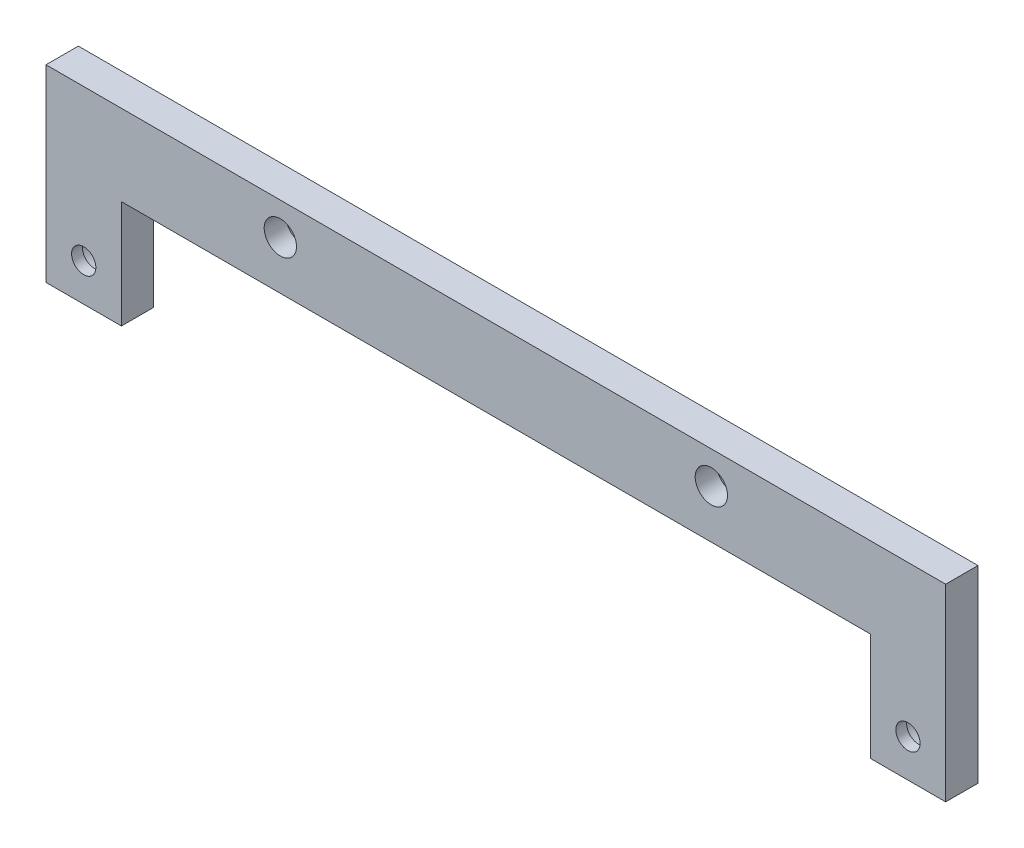
ISO-10303-21;
HEADER;
FILE_DESCRIPTION(('STEP AP214'),'2;1');
FILE_NAME('part.step','',(''),(''),'','','');
FILE_SCHEMA(('AUTOMOTIVE_DESIGN { 1 0 10303 214 1 1 1 1 }'));
ENDSEC;
DATA;
#1=APPLICATION_CONTEXT('core data for automotive mechanical design processes');
#2=APPLICATION_PROTOCOL_DEFINITION('international standard','automotive_design',2000,#1);
#3=PRODUCT_CONTEXT('',#1,'mechanical');
#4=PRODUCT('Part','Part','',(#3));
#5=PRODUCT_RELATED_PRODUCT_CATEGORY('part','',(#4));
#6=PRODUCT_DEFINITION_FORMATION('','',#4);
#7=PRODUCT_DEFINITION_CONTEXT('part definition',#1,'design');
#8=PRODUCT_DEFINITION('design','',#6,#7);
#9=PRODUCT_DEFINITION_SHAPE('','',#8);
#10=(LENGTH_UNIT() NAMED_UNIT(*) SI_UNIT(.MILLI.,.METRE.));
#11=(NAMED_UNIT(*) PLANE_ANGLE_UNIT() SI_UNIT($,.RADIAN.));
#12=(NAMED_UNIT(*) SI_UNIT($,.STERADIAN.) SOLID_ANGLE_UNIT());
#13=UNCERTAINTY_MEASURE_WITH_UNIT(LENGTH_MEASURE(1.E-05),#10,'distance_accuracy_value','');
#14=(GEOMETRIC_REPRESENTATION_CONTEXT(3) GLOBAL_UNCERTAINTY_ASSIGNED_CONTEXT((#13)) GLOBAL_UNIT_ASSIGNED_CONTEXT((#10,
#11,#12)) REPRESENTATION_CONTEXT('',''));
#15=CARTESIAN_POINT('',(0.,0.,0.));
#16=DIRECTION('',(0.,0.,1.));
#17=DIRECTION('',(1.,0.,0.));
#18=AXIS2_PLACEMENT_3D('',#15,#16,#17);
#19=CARTESIAN_POINT('',(76.5,-10.5,0.));
#20=DIRECTION('',(0.,0.,-1.));
#21=DIRECTION('',(-1.,0.,0.));
#22=AXIS2_PLACEMENT_3D('',#19,#20,#21);
#23=CYLINDRICAL_SURFACE('',#22,4.);
#24=CARTESIAN_POINT('',(76.5,-10.5,4.));
#25=DIRECTION('',(0.,0.,-1.));
#26=DIRECTION('',(-1.,0.,0.));
#27=AXIS2_PLACEMENT_3D('',#24,#25,#26);
#28=CIRCLE('',#27,4.);
#29=CARTESIAN_POINT('',(72.5,-10.5,4.));
#30=VERTEX_POINT('',#29);
#31=EDGE_CURVE('E20',#30,#30,#28,.F.);
#32=ORIENTED_EDGE('',*,*,#31,.T.);
#33=EDGE_LOOP('',(#32));
#34=FACE_BOUND('',#33,.T.);
#35=CARTESIAN_POINT('',(76.5,-10.5,0.));
#36=DIRECTION('',(0.,0.,-1.));
#37=DIRECTION('',(-1.,0.,0.));
#38=AXIS2_PLACEMENT_3D('',#35,#36,#37);
#39=CIRCLE('',#38,4.);
#40=CARTESIAN_POINT('',(72.5,-10.5,0.));
#41=VERTEX_POINT('',#40);
#42=EDGE_CURVE('E143',#41,#41,#39,.T.);
#43=ORIENTED_EDGE('',*,*,#42,.T.);
#44=EDGE_LOOP('',(#43));
#45=FACE_BOUND('',#44,.T.);
#46=ADVANCED_FACE('F17',(#34,#45),#23,.F.);
#47=CARTESIAN_POINT('',(-76.5,-10.5,0.));
#48=DIRECTION('',(0.,0.,-1.));
#49=DIRECTION('',(-1.,0.,0.));
#50=AXIS2_PLACEMENT_3D('',#47,#48,#49);
#51=CYLINDRICAL_SURFACE('',#50,4.);
#52=CARTESIAN_POINT('',(-76.5,-10.5,4.));
#53=DIRECTION('',(0.,0.,-1.));
#54=DIRECTION('',(-1.,0.,0.));
#55=AXIS2_PLACEMENT_3D('',#52,#53,#54);
#56=CIRCLE('',#55,4.);
#57=CARTESIAN_POINT('',(-80.5,-10.5,4.));
#58=VERTEX_POINT('',#57);
#59=EDGE_CURVE('E151',#58,#58,#56,.F.);
#60=ORIENTED_EDGE('',*,*,#59,.T.);
#61=EDGE_LOOP('',(#60));
#62=FACE_BOUND('',#61,.T.);
#63=CARTESIAN_POINT('',(-76.5,-10.5,0.));
#64=DIRECTION('',(0.,0.,-1.));
#65=DIRECTION('',(-1.,0.,0.));
#66=AXIS2_PLACEMENT_3D('',#63,#64,#65);
#67=CIRCLE('',#66,4.);
#68=CARTESIAN_POINT('',(-80.5,-10.5,0.));
#69=VERTEX_POINT('',#68);
#70=EDGE_CURVE('E140',#69,#69,#67,.T.);
#71=ORIENTED_EDGE('',*,*,#70,.T.);
#72=EDGE_LOOP('',(#71));
#73=FACE_BOUND('',#72,.T.);
#74=ADVANCED_FACE('F241',(#62,#73),#51,.F.);
#75=CARTESIAN_POINT('',(-40.,11.5,6.));
#76=DIRECTION('',(0.,0.,1.));
#77=DIRECTION('',(1.,0.,0.));
#78=AXIS2_PLACEMENT_3D('',#75,#76,#77);
#79=CYLINDRICAL_SURFACE('',#78,1.75000000000001);
#80=CARTESIAN_POINT('',(-40.,11.5,0.));
#81=DIRECTION('',(0.,0.,1.));
#82=DIRECTION('',(1.,0.,0.));
#83=AXIS2_PLACEMENT_3D('',#80,#81,#82);
#84=CIRCLE('',#83,1.75000000000001);
#85=CARTESIAN_POINT('',(-38.25,11.5,0.));
#86=VERTEX_POINT('',#85);
#87=EDGE_CURVE('E137',#86,#86,#84,.F.);
#88=ORIENTED_EDGE('',*,*,#87,.T.);
#89=EDGE_LOOP('',(#88));
#90=FACE_BOUND('',#89,.T.);
#91=CARTESIAN_POINT('',(-40.,11.5,2.));
#92=DIRECTION('',(0.,0.,1.));
#93=DIRECTION('',(1.,0.,0.));
#94=AXIS2_PLACEMENT_3D('',#91,#92,#93);
#95=CIRCLE('',#94,1.75000000000001);
#96=CARTESIAN_POINT('',(-38.25,11.5,2.));
#97=VERTEX_POINT('',#96);
#98=EDGE_CURVE('E149',#97,#97,#95,.T.);
#99=ORIENTED_EDGE('',*,*,#98,.T.);
#100=EDGE_LOOP('',(#99));
#101=FACE_BOUND('',#100,.T.);
#102=ADVANCED_FACE('F238',(#90,#101),#79,.F.);
#103=CARTESIAN_POINT('',(40.,11.5,6.));
#104=DIRECTION('',(0.,0.,1.));
#105=DIRECTION('',(1.,0.,0.));
#106=AXIS2_PLACEMENT_3D('',#103,#104,#105);
#107=CYLINDRICAL_SURFACE('',#106,1.75000000000001);
#108=CARTESIAN_POINT('',(40.,11.5,0.));
#109=DIRECTION('',(0.,0.,1.));
#110=DIRECTION('',(1.,0.,0.));
#111=AXIS2_PLACEMENT_3D('',#108,#109,#110);
#112=CIRCLE('',#111,1.75000000000001);
#113=CARTESIAN_POINT('',(41.75,11.5,0.));
#114=VERTEX_POINT('',#113);
#115=EDGE_CURVE('E134',#114,#114,#112,.F.);
#116=ORIENTED_EDGE('',*,*,#115,.T.);
#117=EDGE_LOOP('',(#116));
#118=FACE_BOUND('',#117,.T.);
#119=CARTESIAN_POINT('',(40.,11.5,2.));
#120=DIRECTION('',(0.,0.,1.));
#121=DIRECTION('',(1.,0.,0.));
#122=AXIS2_PLACEMENT_3D('',#119,#120,#121);
#123=CIRCLE('',#122,1.75000000000001);
#124=CARTESIAN_POINT('',(41.75,11.5,2.));
#125=VERTEX_POINT('',#124);
#126=EDGE_CURVE('E146',#125,#125,#123,.T.);
#127=ORIENTED_EDGE('',*,*,#126,.T.);
#128=EDGE_LOOP('',(#127));
#129=FACE_BOUND('',#128,.T.);
#130=ADVANCED_FACE('F164',(#118,#129),#107,.F.);
#131=CARTESIAN_POINT('',(78.75,-10.5,4.));
#132=DIRECTION('',(0.,0.,1.));
#133=DIRECTION('',(1.,0.,0.));
#134=AXIS2_PLACEMENT_3D('',#131,#132,#133);
#135=PLANE('',#134);
#136=ORIENTED_EDGE('',*,*,#31,.F.);
#137=EDGE_LOOP('',(#136));
#138=FACE_BOUND('',#137,.T.);
#139=CARTESIAN_POINT('',(76.5,-10.5,4.));
#140=DIRECTION('',(0.,0.,-1.));
#141=DIRECTION('',(-1.,0.,0.));
#142=AXIS2_PLACEMENT_3D('',#139,#140,#141);
#143=CIRCLE('',#142,2.25);
#144=CARTESIAN_POINT('',(74.25,-10.5,4.));
#145=VERTEX_POINT('',#144);
#146=EDGE_CURVE('E131',#145,#145,#143,.F.);
#147=ORIENTED_EDGE('',*,*,#146,.T.);
#148=EDGE_LOOP('',(#147));
#149=FACE_BOUND('',#148,.T.);
#150=ADVANCED_FACE('F160',(#138,#149),#135,.F.);
#151=CARTESIAN_POINT('',(-74.25,-10.5,4.));
#152=DIRECTION('',(0.,0.,1.));
#153=DIRECTION('',(1.,0.,0.));
#154=AXIS2_PLACEMENT_3D('',#151,#152,#153);
#155=PLANE('',#154);
#156=ORIENTED_EDGE('',*,*,#59,.F.);
#157=EDGE_LOOP('',(#156));
#158=FACE_BOUND('',#157,.T.);
#159=CARTESIAN_POINT('',(-76.5,-10.5,4.));
#160=DIRECTION('',(0.,0.,-1.));
#161=DIRECTION('',(-1.,0.,0.));
#162=AXIS2_PLACEMENT_3D('',#159,#160,#161);
#163=CIRCLE('',#162,2.25);
#164=CARTESIAN_POINT('',(-78.75,-10.5,4.));
#165=VERTEX_POINT('',#164);
#166=EDGE_CURVE('E128',#165,#165,#163,.F.);
#167=ORIENTED_EDGE('',*,*,#166,.T.);
#168=EDGE_LOOP('',(#167));
#169=FACE_BOUND('',#168,.T.);
#170=ADVANCED_FACE('F163',(#158,#169),#155,.F.);
#171=CARTESIAN_POINT('',(-38.25,11.5,2.));
#172=DIRECTION('',(0.,0.,-1.));
#173=DIRECTION('',(-1.,0.,0.));
#174=AXIS2_PLACEMENT_3D('',#171,#172,#173);
#175=PLANE('',#174);
#176=CARTESIAN_POINT('',(-40.,11.5,2.));
#177=DIRECTION('',(0.,0.,1.));
#178=DIRECTION('',(1.,0.,0.));
#179=AXIS2_PLACEMENT_3D('',#176,#177,#178);
#180=CIRCLE('',#179,3.);
#181=CARTESIAN_POINT('',(-37.,11.5,2.));
#182=VERTEX_POINT('',#181);
#183=EDGE_CURVE('E125',#182,#182,#180,.T.);
#184=ORIENTED_EDGE('',*,*,#183,.T.);
#185=EDGE_LOOP('',(#184));
#186=FACE_BOUND('',#185,.T.);
#187=ORIENTED_EDGE('',*,*,#98,.F.);
#188=EDGE_LOOP('',(#187));
#189=FACE_BOUND('',#188,.T.);
#190=ADVANCED_FACE('F228',(#186,#189),#175,.F.);
#191=CARTESIAN_POINT('',(41.75,11.5,2.));
#192=DIRECTION('',(0.,0.,-1.));
#193=DIRECTION('',(-1.,0.,0.));
#194=AXIS2_PLACEMENT_3D('',#191,#192,#193);
#195=PLANE('',#194);
#196=CARTESIAN_POINT('',(40.,11.5,2.));
#197=DIRECTION('',(0.,0.,1.));
#198=DIRECTION('',(1.,0.,0.));
#199=AXIS2_PLACEMENT_3D('',#196,#197,#198);
#200=CIRCLE('',#199,3.);
#201=CARTESIAN_POINT('',(43.,11.5,2.));
#202=VERTEX_POINT('',#201);
#203=EDGE_CURVE('E99',#202,#202,#200,.T.);
#204=ORIENTED_EDGE('',*,*,#203,.T.);
#205=EDGE_LOOP('',(#204));
#206=FACE_BOUND('',#205,.T.);
#207=ORIENTED_EDGE('',*,*,#126,.F.);
#208=EDGE_LOOP('',(#207));
#209=FACE_BOUND('',#208,.T.);
#210=ADVANCED_FACE('F225',(#206,#209),#195,.F.);
#211=CARTESIAN_POINT('',(0.,0.,0.));
#212=DIRECTION('',(0.,0.,1.));
#213=DIRECTION('',(1.,0.,0.));
#214=AXIS2_PLACEMENT_3D('',#211,#212,#213);
#215=PLANE('',#214);
#216=DIRECTION('',(0.,1.,0.));
#217=VECTOR('',#216,1.);
#218=CARTESIAN_POINT('',(69.5,2.5,0.));
#219=LINE('',#218,#217);
#220=CARTESIAN_POINT('',(69.5,-17.5,0.));
#221=VERTEX_POINT('',#220);
#222=CARTESIAN_POINT('',(69.5,2.5,0.));
#223=VERTEX_POINT('',#222);
#224=EDGE_CURVE('E86',#221,#223,#219,.T.);
#225=ORIENTED_EDGE('',*,*,#224,.T.);
#226=DIRECTION('',(1.,0.,0.));
#227=VECTOR('',#226,1.);
#228=CARTESIAN_POINT('',(-69.5,2.5,0.));
#229=LINE('',#228,#227);
#230=CARTESIAN_POINT('',(-69.5,2.5,0.));
#231=VERTEX_POINT('',#230);
#232=EDGE_CURVE('E430',#223,#231,#229,.F.);
#233=ORIENTED_EDGE('',*,*,#232,.T.);
#234=DIRECTION('',(0.,1.,0.));
#235=VECTOR('',#234,1.);
#236=CARTESIAN_POINT('',(-69.5,2.5,0.));
#237=LINE('',#236,#235);
#238=CARTESIAN_POINT('',(-69.5,-17.5,0.));
#239=VERTEX_POINT('',#238);
#240=EDGE_CURVE('E433',#231,#239,#237,.F.);
#241=ORIENTED_EDGE('',*,*,#240,.T.);
#242=DIRECTION('',(1.,0.,0.));
#243=VECTOR('',#242,1.);
#244=CARTESIAN_POINT('',(-83.5,-17.5,0.));
#245=LINE('',#244,#243);
#246=CARTESIAN_POINT('',(-83.5,-17.5,0.));
#247=VERTEX_POINT('',#246);
#248=EDGE_CURVE('E438',#239,#247,#245,.F.);
#249=ORIENTED_EDGE('',*,*,#248,.T.);
#250=DIRECTION('',(0.,1.,0.));
#251=VECTOR('',#250,1.);
#252=CARTESIAN_POINT('',(-83.5,17.5,0.));
#253=LINE('',#252,#251);
#254=CARTESIAN_POINT('',(-83.5,17.5,0.));
#255=VERTEX_POINT('',#254);
#256=EDGE_CURVE('E443',#247,#255,#253,.T.);
#257=ORIENTED_EDGE('',*,*,#256,.T.);
#258=DIRECTION('',(1.,0.,0.));
#259=VECTOR('',#258,1.);
#260=CARTESIAN_POINT('',(-83.5,17.5,0.));
#261=LINE('',#260,#259);
#262=CARTESIAN_POINT('',(83.5,17.5,0.));
#263=VERTEX_POINT('',#262);
#264=EDGE_CURVE('E414',#255,#263,#261,.T.);
#265=ORIENTED_EDGE('',*,*,#264,.T.);
#266=DIRECTION('',(0.,1.,0.));
#267=VECTOR('',#266,1.);
#268=CARTESIAN_POINT('',(83.5,17.5,0.));
#269=LINE('',#268,#267);
#270=CARTESIAN_POINT('',(83.5,-17.5,0.));
#271=VERTEX_POINT('',#270);
#272=EDGE_CURVE('E89',#263,#271,#269,.F.);
#273=ORIENTED_EDGE('',*,*,#272,.T.);
#274=DIRECTION('',(1.,0.,0.));
#275=VECTOR('',#274,1.);
#276=CARTESIAN_POINT('',(-83.5,-17.5,0.));
#277=LINE('',#276,#275);
#278=EDGE_CURVE('E80',#271,#221,#277,.F.);
#279=ORIENTED_EDGE('',*,*,#278,.T.);
#280=EDGE_LOOP('',(#225,#233,#241,#249,#257,#265,#273,#279));
#281=FACE_BOUND('',#280,.T.);
#282=ORIENTED_EDGE('',*,*,#115,.F.);
#283=EDGE_LOOP('',(#282));
#284=FACE_BOUND('',#283,.T.);
#285=ORIENTED_EDGE('',*,*,#87,.F.);
#286=EDGE_LOOP('',(#285));
#287=FACE_BOUND('',#286,.T.);
#288=ORIENTED_EDGE('',*,*,#70,.F.);
#289=EDGE_LOOP('',(#288));
#290=FACE_BOUND('',#289,.T.);
#291=ORIENTED_EDGE('',*,*,#42,.F.);
#292=EDGE_LOOP('',(#291));
#293=FACE_BOUND('',#292,.T.);
#294=ADVANCED_FACE('F84',(#281,#284,#287,#290,#293),#215,.F.);
#295=CARTESIAN_POINT('',(76.5,-10.5,0.));
#296=DIRECTION('',(0.,0.,-1.));
#297=DIRECTION('',(-1.,0.,0.));
#298=AXIS2_PLACEMENT_3D('',#295,#296,#297);
#299=CYLINDRICAL_SURFACE('',#298,2.25);
#300=ORIENTED_EDGE('',*,*,#146,.F.);
#301=EDGE_LOOP('',(#300));
#302=FACE_BOUND('',#301,.T.);
#303=CARTESIAN_POINT('',(76.5,-10.5,6.));
#304=DIRECTION('',(0.,0.,-1.));
#305=DIRECTION('',(-1.,0.,0.));
#306=AXIS2_PLACEMENT_3D('',#303,#304,#305);
#307=CIRCLE('',#306,2.25);
#308=CARTESIAN_POINT('',(74.25,-10.5,6.));
#309=VERTEX_POINT('',#308);
#310=EDGE_CURVE('E120',#309,#309,#307,.T.);
#311=ORIENTED_EDGE('',*,*,#310,.F.);
#312=EDGE_LOOP('',(#311));
#313=FACE_BOUND('',#312,.T.);
#314=ADVANCED_FACE('F168',(#302,#313),#299,.F.);
#315=CARTESIAN_POINT('',(-76.5,-10.5,0.));
#316=DIRECTION('',(0.,0.,-1.));
#317=DIRECTION('',(-1.,0.,0.));
#318=AXIS2_PLACEMENT_3D('',#315,#316,#317);
#319=CYLINDRICAL_SURFACE('',#318,2.25);
#320=ORIENTED_EDGE('',*,*,#166,.F.);
#321=EDGE_LOOP('',(#320));
#322=FACE_BOUND('',#321,.T.);
#323=CARTESIAN_POINT('',(-76.5,-10.5,6.));
#324=DIRECTION('',(0.,0.,-1.));
#325=DIRECTION('',(-1.,0.,0.));
#326=AXIS2_PLACEMENT_3D('',#323,#324,#325);
#327=CIRCLE('',#326,2.25);
#328=CARTESIAN_POINT('',(-78.75,-10.5,6.));
#329=VERTEX_POINT('',#328);
#330=EDGE_CURVE('E117',#329,#329,#327,.T.);
#331=ORIENTED_EDGE('',*,*,#330,.F.);
#332=EDGE_LOOP('',(#331));
#333=FACE_BOUND('',#332,.T.);
#334=ADVANCED_FACE('F171',(#322,#333),#319,.F.);
#335=CARTESIAN_POINT('',(-40.,11.5,6.));
#336=DIRECTION('',(0.,0.,1.));
#337=DIRECTION('',(1.,0.,0.));
#338=AXIS2_PLACEMENT_3D('',#335,#336,#337);
#339=CYLINDRICAL_SURFACE('',#338,3.);
#340=CARTESIAN_POINT('',(-40.,11.5,6.));
#341=DIRECTION('',(0.,0.,1.));
#342=DIRECTION('',(1.,0.,0.));
#343=AXIS2_PLACEMENT_3D('',#340,#341,#342);
#344=CIRCLE('',#343,3.);
#345=CARTESIAN_POINT('',(-37.,11.5,6.));
#346=VERTEX_POINT('',#345);
#347=EDGE_CURVE('E114',#346,#346,#344,.F.);
#348=ORIENTED_EDGE('',*,*,#347,.F.);
#349=EDGE_LOOP('',(#348));
#350=FACE_BOUND('',#349,.T.);
#351=ORIENTED_EDGE('',*,*,#183,.F.);
#352=EDGE_LOOP('',(#351));
#353=FACE_BOUND('',#352,.T.);
#354=ADVANCED_FACE('F215',(#350,#353),#339,.F.);
#355=CARTESIAN_POINT('',(40.,11.5,6.));
#356=DIRECTION('',(0.,0.,1.));
#357=DIRECTION('',(1.,0.,0.));
#358=AXIS2_PLACEMENT_3D('',#355,#356,#357);
#359=CYLINDRICAL_SURFACE('',#358,3.);
#360=CARTESIAN_POINT('',(40.,11.5,6.));
#361=DIRECTION('',(0.,0.,1.));
#362=DIRECTION('',(1.,0.,0.));
#363=AXIS2_PLACEMENT_3D('',#360,#361,#362);
#364=CIRCLE('',#363,3.);
#365=CARTESIAN_POINT('',(43.,11.5,6.));
#366=VERTEX_POINT('',#365);
#367=EDGE_CURVE('E110',#366,#366,#364,.F.);
#368=ORIENTED_EDGE('',*,*,#367,.F.);
#369=EDGE_LOOP('',(#368));
#370=FACE_BOUND('',#369,.T.);
#371=ORIENTED_EDGE('',*,*,#203,.F.);
#372=EDGE_LOOP('',(#371));
#373=FACE_BOUND('',#372,.T.);
#374=ADVANCED_FACE('F212',(#370,#373),#359,.F.);
#375=CARTESIAN_POINT('',(69.5,2.5,0.));
#376=DIRECTION('',(1.,0.,0.));
#377=DIRECTION('',(0.,0.,-1.));
#378=AXIS2_PLACEMENT_3D('',#375,#376,#377);
#379=PLANE('',#378);
#380=DIRECTION('',(0.,0.,1.));
#381=VECTOR('',#380,1.);
#382=CARTESIAN_POINT('',(69.5,2.5,0.));
#383=LINE('',#382,#381);
#384=CARTESIAN_POINT('',(69.5,2.5,6.));
#385=VERTEX_POINT('',#384);
#386=EDGE_CURVE('E97',#385,#223,#383,.F.);
#387=ORIENTED_EDGE('',*,*,#386,.T.);
#388=ORIENTED_EDGE('',*,*,#224,.F.);
#389=DIRECTION('',(0.,0.,1.));
#390=VECTOR('',#389,1.);
#391=CARTESIAN_POINT('',(69.5,-17.5,6.));
#392=LINE('',#391,#390);
#393=CARTESIAN_POINT('',(69.5,-17.5,6.));
#394=VERTEX_POINT('',#393);
#395=EDGE_CURVE('E91',#221,#394,#392,.T.);
#396=ORIENTED_EDGE('',*,*,#395,.T.);
#397=DIRECTION('',(0.,1.,0.));
#398=VECTOR('',#397,1.);
#399=CARTESIAN_POINT('',(69.5,0.,6.));
#400=LINE('',#399,#398);
#401=EDGE_CURVE('E113',#385,#394,#400,.F.);
#402=ORIENTED_EDGE('',*,*,#401,.F.);
#403=EDGE_LOOP('',(#387,#388,#396,#402));
#404=FACE_BOUND('',#403,.T.);
#405=ADVANCED_FACE('F94',(#404),#379,.F.);
#406=CARTESIAN_POINT('',(-83.5,-17.5,6.));
#407=DIRECTION('',(0.,1.,0.));
#408=DIRECTION('',(0.,0.,1.));
#409=AXIS2_PLACEMENT_3D('',#406,#407,#408);
#410=PLANE('',#409);
#411=ORIENTED_EDGE('',*,*,#395,.F.);
#412=ORIENTED_EDGE('',*,*,#278,.F.);
#413=DIRECTION('',(0.,0.,1.));
#414=VECTOR('',#413,1.);
#415=CARTESIAN_POINT('',(83.5,-17.5,6.));
#416=LINE('',#415,#414);
#417=CARTESIAN_POINT('',(83.5,-17.5,6.));
#418=VERTEX_POINT('',#417);
#419=EDGE_CURVE('E105',#271,#418,#416,.T.);
#420=ORIENTED_EDGE('',*,*,#419,.T.);
#421=DIRECTION('',(1.,0.,0.));
#422=VECTOR('',#421,1.);
#423=CARTESIAN_POINT('',(0.,-17.5,6.));
#424=LINE('',#423,#422);
#425=EDGE_CURVE('E103',#394,#418,#424,.T.);
#426=ORIENTED_EDGE('',*,*,#425,.F.);
#427=EDGE_LOOP('',(#411,#412,#420,#426));
#428=FACE_BOUND('',#427,.T.);
#429=ADVANCED_FACE('F101',(#428),#410,.F.);
#430=CARTESIAN_POINT('',(83.5,17.5,6.));
#431=DIRECTION('',(-1.,0.,0.));
#432=DIRECTION('',(0.,0.,1.));
#433=AXIS2_PLACEMENT_3D('',#430,#431,#432);
#434=PLANE('',#433);
#435=DIRECTION('',(0.,0.,-1.));
#436=VECTOR('',#435,1.);
#437=CARTESIAN_POINT('',(83.5,17.5,6.));
#438=LINE('',#437,#436);
#439=CARTESIAN_POINT('',(83.5,17.5,6.));
#440=VERTEX_POINT('',#439);
#441=EDGE_CURVE('E410',#263,#440,#438,.F.);
#442=ORIENTED_EDGE('',*,*,#441,.T.);
#443=DIRECTION('',(0.,1.,0.));
#444=VECTOR('',#443,1.);
#445=CARTESIAN_POINT('',(83.5,0.,6.));
#446=LINE('',#445,#444);
#447=EDGE_CURVE('E413',#418,#440,#446,.T.);
#448=ORIENTED_EDGE('',*,*,#447,.F.);
#449=ORIENTED_EDGE('',*,*,#419,.F.);
#450=ORIENTED_EDGE('',*,*,#272,.F.);
#451=EDGE_LOOP('',(#442,#448,#449,#450));
#452=FACE_BOUND('',#451,.T.);
#453=ADVANCED_FACE('F203',(#452),#434,.F.);
#454=CARTESIAN_POINT('',(-83.5,17.5,6.));
#455=DIRECTION('',(0.,-1.,0.));
#456=DIRECTION('',(0.,0.,-1.));
#457=AXIS2_PLACEMENT_3D('',#454,#455,#456);
#458=PLANE('',#457);
#459=DIRECTION('',(0.,0.,-1.));
#460=VECTOR('',#459,1.);
#461=CARTESIAN_POINT('',(-83.5,17.5,6.));
#462=LINE('',#461,#460);
#463=CARTESIAN_POINT('',(-83.5,17.5,6.));
#464=VERTEX_POINT('',#463);
#465=EDGE_CURVE('E419',#255,#464,#462,.F.);
#466=ORIENTED_EDGE('',*,*,#465,.T.);
#467=DIRECTION('',(1.,0.,0.));
#468=VECTOR('',#467,1.);
#469=CARTESIAN_POINT('',(0.,17.5,6.));
#470=LINE('',#469,#468);
#471=EDGE_CURVE('E417',#440,#464,#470,.F.);
#472=ORIENTED_EDGE('',*,*,#471,.F.);
#473=ORIENTED_EDGE('',*,*,#441,.F.);
#474=ORIENTED_EDGE('',*,*,#264,.F.);
#475=EDGE_LOOP('',(#466,#472,#473,#474));
#476=FACE_BOUND('',#475,.T.);
#477=ADVANCED_FACE('F199',(#476),#458,.F.);
#478=CARTESIAN_POINT('',(-83.5,17.5,6.));
#479=DIRECTION('',(1.,0.,0.));
#480=DIRECTION('',(0.,0.,-1.));
#481=AXIS2_PLACEMENT_3D('',#478,#479,#480);
#482=PLANE('',#481);
#483=DIRECTION('',(0.,0.,1.));
#484=VECTOR('',#483,1.);
#485=CARTESIAN_POINT('',(-83.5,-17.5,6.));
#486=LINE('',#485,#484);
#487=CARTESIAN_POINT('',(-83.5,-17.5,6.));
#488=VERTEX_POINT('',#487);
#489=EDGE_CURVE('E441',#247,#488,#486,.T.);
#490=ORIENTED_EDGE('',*,*,#489,.T.);
#491=DIRECTION('',(0.,1.,0.));
#492=VECTOR('',#491,1.);
#493=CARTESIAN_POINT('',(-83.5,0.,6.));
#494=LINE('',#493,#492);
#495=EDGE_CURVE('E422',#464,#488,#494,.F.);
#496=ORIENTED_EDGE('',*,*,#495,.F.);
#497=ORIENTED_EDGE('',*,*,#465,.F.);
#498=ORIENTED_EDGE('',*,*,#256,.F.);
#499=EDGE_LOOP('',(#490,#496,#497,#498));
#500=FACE_BOUND('',#499,.T.);
#501=ADVANCED_FACE('F195',(#500),#482,.F.);
#502=CARTESIAN_POINT('',(-83.5,-17.5,6.));
#503=DIRECTION('',(0.,1.,0.));
#504=DIRECTION('',(0.,0.,1.));
#505=AXIS2_PLACEMENT_3D('',#502,#503,#504);
#506=PLANE('',#505);
#507=DIRECTION('',(0.,0.,1.));
#508=VECTOR('',#507,1.);
#509=CARTESIAN_POINT('',(-69.5,-17.5,0.));
#510=LINE('',#509,#508);
#511=CARTESIAN_POINT('',(-69.5,-17.5,6.));
#512=VERTEX_POINT('',#511);
#513=EDGE_CURVE('E436',#239,#512,#510,.T.);
#514=ORIENTED_EDGE('',*,*,#513,.T.);
#515=DIRECTION('',(1.,0.,0.));
#516=VECTOR('',#515,1.);
#517=CARTESIAN_POINT('',(0.,-17.5,6.));
#518=LINE('',#517,#516);
#519=EDGE_CURVE('E450',#488,#512,#518,.T.);
#520=ORIENTED_EDGE('',*,*,#519,.F.);
#521=ORIENTED_EDGE('',*,*,#489,.F.);
#522=ORIENTED_EDGE('',*,*,#248,.F.);
#523=EDGE_LOOP('',(#514,#520,#521,#522));
#524=FACE_BOUND('',#523,.T.);
#525=ADVANCED_FACE('F192',(#524),#506,.F.);
#526=CARTESIAN_POINT('',(-69.5,2.5,0.));
#527=DIRECTION('',(-1.,0.,0.));
#528=DIRECTION('',(0.,0.,1.));
#529=AXIS2_PLACEMENT_3D('',#526,#527,#528);
#530=PLANE('',#529);
#531=DIRECTION('',(0.,0.,1.));
#532=VECTOR('',#531,1.);
#533=CARTESIAN_POINT('',(-69.5,2.5,0.));
#534=LINE('',#533,#532);
#535=CARTESIAN_POINT('',(-69.5,2.5,6.));
#536=VERTEX_POINT('',#535);
#537=EDGE_CURVE('E35',#231,#536,#534,.T.);
#538=ORIENTED_EDGE('',*,*,#537,.T.);
#539=DIRECTION('',(0.,1.,0.));
#540=VECTOR('',#539,1.);
#541=CARTESIAN_POINT('',(-69.5,0.,6.));
#542=LINE('',#541,#540);
#543=EDGE_CURVE('E26',#512,#536,#542,.T.);
#544=ORIENTED_EDGE('',*,*,#543,.F.);
#545=ORIENTED_EDGE('',*,*,#513,.F.);
#546=ORIENTED_EDGE('',*,*,#240,.F.);
#547=EDGE_LOOP('',(#538,#544,#545,#546));
#548=FACE_BOUND('',#547,.T.);
#549=ADVANCED_FACE('F184',(#548),#530,.F.);
#550=CARTESIAN_POINT('',(-69.5,2.5,0.));
#551=DIRECTION('',(0.,1.,0.));
#552=DIRECTION('',(0.,0.,1.));
#553=AXIS2_PLACEMENT_3D('',#550,#551,#552);
#554=PLANE('',#553);
#555=ORIENTED_EDGE('',*,*,#537,.F.);
#556=ORIENTED_EDGE('',*,*,#232,.F.);
#557=ORIENTED_EDGE('',*,*,#386,.F.);
#558=DIRECTION('',(1.,0.,0.));
#559=VECTOR('',#558,1.);
#560=CARTESIAN_POINT('',(0.,2.5,6.));
#561=LINE('',#560,#559);
#562=EDGE_CURVE('E11',#536,#385,#561,.T.);
#563=ORIENTED_EDGE('',*,*,#562,.F.);
#564=EDGE_LOOP('',(#555,#556,#557,#563));
#565=FACE_BOUND('',#564,.T.);
#566=ADVANCED_FACE('F177',(#565),#554,.F.);
#567=CARTESIAN_POINT('',(0.,0.,6.));
#568=DIRECTION('',(0.,0.,1.));
#569=DIRECTION('',(1.,0.,0.));
#570=AXIS2_PLACEMENT_3D('',#567,#568,#569);
#571=PLANE('',#570);
#572=ORIENTED_EDGE('',*,*,#543,.T.);
#573=ORIENTED_EDGE('',*,*,#562,.T.);
#574=ORIENTED_EDGE('',*,*,#401,.T.);
#575=ORIENTED_EDGE('',*,*,#425,.T.);
#576=ORIENTED_EDGE('',*,*,#447,.T.);
#577=ORIENTED_EDGE('',*,*,#471,.T.);
#578=ORIENTED_EDGE('',*,*,#495,.T.);
#579=ORIENTED_EDGE('',*,*,#519,.T.);
#580=EDGE_LOOP('',(#572,#573,#574,#575,#576,#577,#578,#579));
#581=FACE_BOUND('',#580,.T.);
#582=ORIENTED_EDGE('',*,*,#367,.T.);
#583=EDGE_LOOP('',(#582));
#584=FACE_BOUND('',#583,.T.);
#585=ORIENTED_EDGE('',*,*,#347,.T.);
#586=EDGE_LOOP('',(#585));
#587=FACE_BOUND('',#586,.T.);
#588=ORIENTED_EDGE('',*,*,#330,.T.);
#589=EDGE_LOOP('',(#588));
#590=FACE_BOUND('',#589,.T.);
#591=ORIENTED_EDGE('',*,*,#310,.T.);
#592=EDGE_LOOP('',(#591));
#593=FACE_BOUND('',#592,.T.);
#594=ADVANCED_FACE('F175',(#581,#584,#587,#590,#593),#571,.T.);
#595=CLOSED_SHELL('',(#46,#74,#102,#130,#150,#170,#190,#210,#294,#314,#334,#354,#374,#405,#429,
#453,#477,#501,#525,#549,#566,#594));
#596=MANIFOLD_SOLID_BREP('B1',#595);
#597=ADVANCED_BREP_SHAPE_REPRESENTATION('',(#18,#596),#14);
#598=SHAPE_DEFINITION_REPRESENTATION(#9,#597);
ENDSEC;
END-ISO-10303-21;
